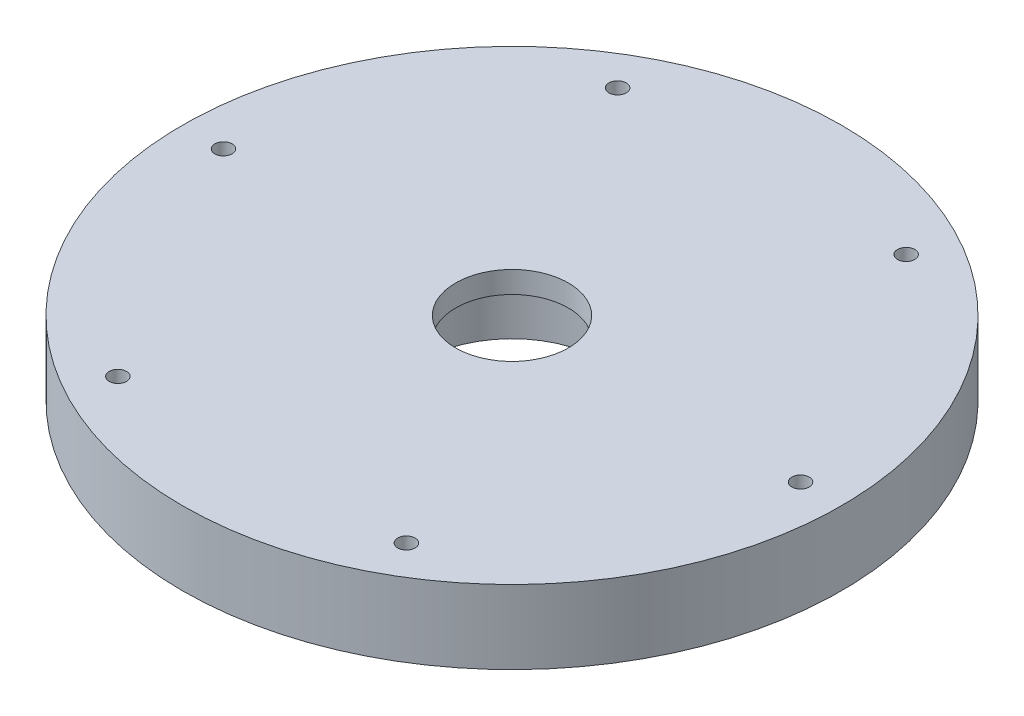
ISO-10303-21;
HEADER;
FILE_DESCRIPTION(('STEP AP214'),'2;1');
FILE_NAME('part.step','',(''),(''),'','','');
FILE_SCHEMA(('AUTOMOTIVE_DESIGN { 1 0 10303 214 1 1 1 1 }'));
ENDSEC;
DATA;
#1=APPLICATION_CONTEXT('core data for automotive mechanical design processes');
#2=APPLICATION_PROTOCOL_DEFINITION('international standard','automotive_design',2000,#1);
#3=PRODUCT_CONTEXT('',#1,'mechanical');
#4=PRODUCT('Part','Part','',(#3));
#5=PRODUCT_RELATED_PRODUCT_CATEGORY('part','',(#4));
#6=PRODUCT_DEFINITION_FORMATION('','',#4);
#7=PRODUCT_DEFINITION_CONTEXT('part definition',#1,'design');
#8=PRODUCT_DEFINITION('design','',#6,#7);
#9=PRODUCT_DEFINITION_SHAPE('','',#8);
#10=(LENGTH_UNIT() NAMED_UNIT(*) SI_UNIT(.MILLI.,.METRE.));
#11=(NAMED_UNIT(*) PLANE_ANGLE_UNIT() SI_UNIT($,.RADIAN.));
#12=(NAMED_UNIT(*) SI_UNIT($,.STERADIAN.) SOLID_ANGLE_UNIT());
#13=UNCERTAINTY_MEASURE_WITH_UNIT(LENGTH_MEASURE(1.E-05),#10,'distance_accuracy_value','');
#14=(GEOMETRIC_REPRESENTATION_CONTEXT(3) GLOBAL_UNCERTAINTY_ASSIGNED_CONTEXT((#13)) GLOBAL_UNIT_ASSIGNED_CONTEXT((#10,
#11,#12)) REPRESENTATION_CONTEXT('',''));
#15=CARTESIAN_POINT('',(0.,0.,0.));
#16=DIRECTION('',(0.,0.,1.));
#17=DIRECTION('',(1.,0.,0.));
#18=AXIS2_PLACEMENT_3D('',#15,#16,#17);
#19=CARTESIAN_POINT('',(0.,38.7086688188191,0.));
#20=DIRECTION('',(0.,1.,0.));
#21=DIRECTION('',(0.,0.,1.));
#22=AXIS2_PLACEMENT_3D('',#19,#20,#21);
#23=CYLINDRICAL_SURFACE('',#22,6.49999999999999);
#24=CARTESIAN_POINT('',(0.,0.,0.));
#25=DIRECTION('',(0.,1.,0.));
#26=DIRECTION('',(0.,0.,1.));
#27=AXIS2_PLACEMENT_3D('',#24,#25,#26);
#28=CIRCLE('',#27,6.49999999999999);
#29=CARTESIAN_POINT('',(0.,0.,6.49999999999999));
#30=VERTEX_POINT('',#29);
#31=EDGE_CURVE('E10',#30,#30,#28,.T.);
#32=ORIENTED_EDGE('',*,*,#31,.T.);
#33=EDGE_LOOP('',(#32));
#34=FACE_BOUND('',#33,.T.);
#35=CARTESIAN_POINT('',(0.,-2.5,0.));
#36=DIRECTION('',(0.,1.,0.));
#37=DIRECTION('',(0.,0.,1.));
#38=AXIS2_PLACEMENT_3D('',#35,#36,#37);
#39=CIRCLE('',#38,6.49999999999999);
#40=CARTESIAN_POINT('',(0.,-2.5,6.49999999999999));
#41=VERTEX_POINT('',#40);
#42=EDGE_CURVE('E65',#41,#41,#39,.T.);
#43=ORIENTED_EDGE('',*,*,#42,.F.);
#44=EDGE_LOOP('',(#43));
#45=FACE_BOUND('',#44,.T.);
#46=ADVANCED_FACE('F37',(#34,#45),#23,.F.);
#47=CARTESIAN_POINT('',(-6.49999999999999,0.,0.));
#48=DIRECTION('',(0.,1.,0.));
#49=DIRECTION('',(0.,0.,1.));
#50=AXIS2_PLACEMENT_3D('',#47,#48,#49);
#51=PLANE('',#50);
#52=CARTESIAN_POINT('',(-33.26875,0.,0.));
#53=DIRECTION('',(0.,-1.,0.));
#54=DIRECTION('',(0.,0.,-1.));
#55=AXIS2_PLACEMENT_3D('',#52,#53,#54);
#56=CIRCLE('',#55,0.999999999999998);
#57=CARTESIAN_POINT('',(-33.26875,0.,-0.999999999999992));
#58=VERTEX_POINT('',#57);
#59=EDGE_CURVE('E68',#58,#58,#56,.T.);
#60=ORIENTED_EDGE('',*,*,#59,.T.);
#61=EDGE_LOOP('',(#60));
#62=FACE_BOUND('',#61,.T.);
#63=CARTESIAN_POINT('',(-16.634375,0.,-28.8115826521536));
#64=DIRECTION('',(0.,-1.,0.));
#65=DIRECTION('',(0.,0.,-1.));
#66=AXIS2_PLACEMENT_3D('',#63,#64,#65);
#67=CIRCLE('',#66,0.999999999999998);
#68=CARTESIAN_POINT('',(-16.634375,0.,-29.8115826521536));
#69=VERTEX_POINT('',#68);
#70=EDGE_CURVE('E95',#69,#69,#67,.T.);
#71=ORIENTED_EDGE('',*,*,#70,.T.);
#72=EDGE_LOOP('',(#71));
#73=FACE_BOUND('',#72,.T.);
#74=CARTESIAN_POINT('',(16.634375,0.,-28.8115826521535));
#75=DIRECTION('',(0.,-1.,0.));
#76=DIRECTION('',(0.,0.,-1.));
#77=AXIS2_PLACEMENT_3D('',#74,#75,#76);
#78=CIRCLE('',#77,0.999999999999998);
#79=CARTESIAN_POINT('',(16.634375,0.,-29.8115826521535));
#80=VERTEX_POINT('',#79);
#81=EDGE_CURVE('E69',#80,#80,#78,.T.);
#82=ORIENTED_EDGE('',*,*,#81,.T.);
#83=EDGE_LOOP('',(#82));
#84=FACE_BOUND('',#83,.T.);
#85=CARTESIAN_POINT('',(33.26875,0.,0.));
#86=DIRECTION('',(0.,-1.,0.));
#87=DIRECTION('',(0.,0.,-1.));
#88=AXIS2_PLACEMENT_3D('',#85,#86,#87);
#89=CIRCLE('',#88,0.999999999999998);
#90=CARTESIAN_POINT('',(33.26875,0.,-1.));
#91=VERTEX_POINT('',#90);
#92=EDGE_CURVE('E76',#91,#91,#89,.T.);
#93=ORIENTED_EDGE('',*,*,#92,.T.);
#94=EDGE_LOOP('',(#93));
#95=FACE_BOUND('',#94,.T.);
#96=CARTESIAN_POINT('',(16.634375,0.,28.8115826521535));
#97=DIRECTION('',(0.,-1.,0.));
#98=DIRECTION('',(0.,0.,-1.));
#99=AXIS2_PLACEMENT_3D('',#96,#97,#98);
#100=CIRCLE('',#99,1.);
#101=CARTESIAN_POINT('',(16.634375,0.,27.8115826521535));
#102=VERTEX_POINT('',#101);
#103=EDGE_CURVE('E82',#102,#102,#100,.T.);
#104=ORIENTED_EDGE('',*,*,#103,.T.);
#105=EDGE_LOOP('',(#104));
#106=FACE_BOUND('',#105,.T.);
#107=CARTESIAN_POINT('',(-16.634375,0.,28.8115826521535));
#108=DIRECTION('',(0.,-1.,0.));
#109=DIRECTION('',(0.,0.,-1.));
#110=AXIS2_PLACEMENT_3D('',#107,#108,#109);
#111=CIRCLE('',#110,0.999999999999998);
#112=CARTESIAN_POINT('',(-16.634375,0.,27.8115826521535));
#113=VERTEX_POINT('',#112);
#114=EDGE_CURVE('E88',#113,#113,#111,.T.);
#115=ORIENTED_EDGE('',*,*,#114,.T.);
#116=EDGE_LOOP('',(#115));
#117=FACE_BOUND('',#116,.T.);
#118=CARTESIAN_POINT('',(0.,0.,0.));
#119=DIRECTION('',(0.,1.,0.));
#120=DIRECTION('',(0.,0.,1.));
#121=AXIS2_PLACEMENT_3D('',#118,#119,#120);
#122=CIRCLE('',#121,38.);
#123=CARTESIAN_POINT('',(0.,0.,38.));
#124=VERTEX_POINT('',#123);
#125=EDGE_CURVE('E43',#124,#124,#122,.T.);
#126=ORIENTED_EDGE('',*,*,#125,.T.);
#127=EDGE_LOOP('',(#126));
#128=FACE_BOUND('',#127,.T.);
#129=ORIENTED_EDGE('',*,*,#31,.F.);
#130=EDGE_LOOP('',(#129));
#131=FACE_BOUND('',#130,.T.);
#132=ADVANCED_FACE('F105',(#62,#73,#84,#95,#106,#117,#128,#131),#51,.T.);
#133=CARTESIAN_POINT('',(0.,38.7086688188191,0.));
#134=DIRECTION('',(0.,1.,0.));
#135=DIRECTION('',(0.,0.,1.));
#136=AXIS2_PLACEMENT_3D('',#133,#134,#135);
#137=CYLINDRICAL_SURFACE('',#136,38.);
#138=CARTESIAN_POINT('',(0.,-8.5,0.));
#139=DIRECTION('',(0.,1.,0.));
#140=DIRECTION('',(0.,0.,1.));
#141=AXIS2_PLACEMENT_3D('',#138,#139,#140);
#142=CIRCLE('',#141,38.);
#143=CARTESIAN_POINT('',(0.,-8.5,38.));
#144=VERTEX_POINT('',#143);
#145=EDGE_CURVE('E47',#144,#144,#142,.T.);
#146=ORIENTED_EDGE('',*,*,#145,.T.);
#147=EDGE_LOOP('',(#146));
#148=FACE_BOUND('',#147,.T.);
#149=ORIENTED_EDGE('',*,*,#125,.F.);
#150=EDGE_LOOP('',(#149));
#151=FACE_BOUND('',#150,.T.);
#152=ADVANCED_FACE('F143',(#148,#151),#137,.T.);
#153=CARTESIAN_POINT('',(-35.,-8.5,0.));
#154=DIRECTION('',(0.,-1.,0.));
#155=DIRECTION('',(0.,0.,-1.));
#156=AXIS2_PLACEMENT_3D('',#153,#154,#155);
#157=PLANE('',#156);
#158=CARTESIAN_POINT('',(0.,-8.5,0.));
#159=DIRECTION('',(0.,1.,0.));
#160=DIRECTION('',(0.,0.,1.));
#161=AXIS2_PLACEMENT_3D('',#158,#159,#160);
#162=CIRCLE('',#161,35.);
#163=CARTESIAN_POINT('',(0.,-8.5,35.));
#164=VERTEX_POINT('',#163);
#165=EDGE_CURVE('E51',#164,#164,#162,.T.);
#166=ORIENTED_EDGE('',*,*,#165,.T.);
#167=EDGE_LOOP('',(#166));
#168=FACE_BOUND('',#167,.T.);
#169=ORIENTED_EDGE('',*,*,#145,.F.);
#170=EDGE_LOOP('',(#169));
#171=FACE_BOUND('',#170,.T.);
#172=ADVANCED_FACE('F137',(#168,#171),#157,.T.);
#173=CARTESIAN_POINT('',(0.,38.7086688188191,0.));
#174=DIRECTION('',(0.,1.,0.));
#175=DIRECTION('',(0.,0.,1.));
#176=AXIS2_PLACEMENT_3D('',#173,#174,#175);
#177=CYLINDRICAL_SURFACE('',#176,35.);
#178=CARTESIAN_POINT('',(0.,-9.75,0.));
#179=DIRECTION('',(0.,1.,0.));
#180=DIRECTION('',(0.,0.,1.));
#181=AXIS2_PLACEMENT_3D('',#178,#179,#180);
#182=CIRCLE('',#181,35.);
#183=CARTESIAN_POINT('',(0.,-9.75,35.));
#184=VERTEX_POINT('',#183);
#185=EDGE_CURVE('E56',#184,#184,#182,.T.);
#186=ORIENTED_EDGE('',*,*,#185,.T.);
#187=EDGE_LOOP('',(#186));
#188=FACE_BOUND('',#187,.T.);
#189=ORIENTED_EDGE('',*,*,#165,.F.);
#190=EDGE_LOOP('',(#189));
#191=FACE_BOUND('',#190,.T.);
#192=ADVANCED_FACE('F119',(#188,#191),#177,.T.);
#193=CARTESIAN_POINT('',(-10.5,-9.75,0.));
#194=DIRECTION('',(0.,-1.,0.));
#195=DIRECTION('',(0.,0.,-1.));
#196=AXIS2_PLACEMENT_3D('',#193,#194,#195);
#197=PLANE('',#196);
#198=CARTESIAN_POINT('',(-33.26875,-9.75,0.));
#199=DIRECTION('',(0.,-1.,0.));
#200=DIRECTION('',(0.,0.,-1.));
#201=AXIS2_PLACEMENT_3D('',#198,#199,#200);
#202=CIRCLE('',#201,0.999999999999998);
#203=CARTESIAN_POINT('',(-33.26875,-9.75,-0.999999999999992));
#204=VERTEX_POINT('',#203);
#205=EDGE_CURVE('E94',#204,#204,#202,.T.);
#206=ORIENTED_EDGE('',*,*,#205,.F.);
#207=EDGE_LOOP('',(#206));
#208=FACE_BOUND('',#207,.T.);
#209=CARTESIAN_POINT('',(-16.634375,-9.75,-28.8115826521536));
#210=DIRECTION('',(0.,-1.,0.));
#211=DIRECTION('',(0.,0.,-1.));
#212=AXIS2_PLACEMENT_3D('',#209,#210,#211);
#213=CIRCLE('',#212,0.999999999999998);
#214=CARTESIAN_POINT('',(-16.634375,-9.75,-29.8115826521536));
#215=VERTEX_POINT('',#214);
#216=EDGE_CURVE('E73',#215,#215,#213,.T.);
#217=ORIENTED_EDGE('',*,*,#216,.F.);
#218=EDGE_LOOP('',(#217));
#219=FACE_BOUND('',#218,.T.);
#220=CARTESIAN_POINT('',(16.634375,-9.75,-28.8115826521535));
#221=DIRECTION('',(0.,-1.,0.));
#222=DIRECTION('',(0.,0.,-1.));
#223=AXIS2_PLACEMENT_3D('',#220,#221,#222);
#224=CIRCLE('',#223,0.999999999999998);
#225=CARTESIAN_POINT('',(16.634375,-9.75,-29.8115826521535));
#226=VERTEX_POINT('',#225);
#227=EDGE_CURVE('E72',#226,#226,#224,.T.);
#228=ORIENTED_EDGE('',*,*,#227,.F.);
#229=EDGE_LOOP('',(#228));
#230=FACE_BOUND('',#229,.T.);
#231=CARTESIAN_POINT('',(33.26875,-9.75,0.));
#232=DIRECTION('',(0.,-1.,0.));
#233=DIRECTION('',(0.,0.,-1.));
#234=AXIS2_PLACEMENT_3D('',#231,#232,#233);
#235=CIRCLE('',#234,0.999999999999998);
#236=CARTESIAN_POINT('',(33.26875,-9.75,-1.));
#237=VERTEX_POINT('',#236);
#238=EDGE_CURVE('E79',#237,#237,#235,.T.);
#239=ORIENTED_EDGE('',*,*,#238,.F.);
#240=EDGE_LOOP('',(#239));
#241=FACE_BOUND('',#240,.T.);
#242=CARTESIAN_POINT('',(16.634375,-9.75,28.8115826521535));
#243=DIRECTION('',(0.,-1.,0.));
#244=DIRECTION('',(0.,0.,-1.));
#245=AXIS2_PLACEMENT_3D('',#242,#243,#244);
#246=CIRCLE('',#245,1.);
#247=CARTESIAN_POINT('',(16.634375,-9.75,27.8115826521535));
#248=VERTEX_POINT('',#247);
#249=EDGE_CURVE('E85',#248,#248,#246,.T.);
#250=ORIENTED_EDGE('',*,*,#249,.F.);
#251=EDGE_LOOP('',(#250));
#252=FACE_BOUND('',#251,.T.);
#253=CARTESIAN_POINT('',(-16.634375,-9.75,28.8115826521535));
#254=DIRECTION('',(0.,-1.,0.));
#255=DIRECTION('',(0.,0.,-1.));
#256=AXIS2_PLACEMENT_3D('',#253,#254,#255);
#257=CIRCLE('',#256,0.999999999999998);
#258=CARTESIAN_POINT('',(-16.634375,-9.75,27.8115826521535));
#259=VERTEX_POINT('',#258);
#260=EDGE_CURVE('E91',#259,#259,#257,.T.);
#261=ORIENTED_EDGE('',*,*,#260,.F.);
#262=EDGE_LOOP('',(#261));
#263=FACE_BOUND('',#262,.T.);
#264=CARTESIAN_POINT('',(0.,-9.74999999999999,0.));
#265=DIRECTION('',(0.,1.,0.));
#266=DIRECTION('',(0.,0.,1.));
#267=AXIS2_PLACEMENT_3D('',#264,#265,#266);
#268=CIRCLE('',#267,10.5);
#269=CARTESIAN_POINT('',(0.,-9.74999999999999,10.5));
#270=VERTEX_POINT('',#269);
#271=EDGE_CURVE('E59',#270,#270,#268,.T.);
#272=ORIENTED_EDGE('',*,*,#271,.T.);
#273=EDGE_LOOP('',(#272));
#274=FACE_BOUND('',#273,.T.);
#275=ORIENTED_EDGE('',*,*,#185,.F.);
#276=EDGE_LOOP('',(#275));
#277=FACE_BOUND('',#276,.T.);
#278=ADVANCED_FACE('F115',(#208,#219,#230,#241,#252,#263,#274,#277),#197,.T.);
#279=CARTESIAN_POINT('',(0.,38.7086688188191,0.));
#280=DIRECTION('',(0.,1.,0.));
#281=DIRECTION('',(0.,0.,1.));
#282=AXIS2_PLACEMENT_3D('',#279,#280,#281);
#283=CYLINDRICAL_SURFACE('',#282,10.5);
#284=CARTESIAN_POINT('',(0.,-2.5,0.));
#285=DIRECTION('',(0.,1.,0.));
#286=DIRECTION('',(0.,0.,1.));
#287=AXIS2_PLACEMENT_3D('',#284,#285,#286);
#288=CIRCLE('',#287,10.5);
#289=CARTESIAN_POINT('',(0.,-2.5,10.5));
#290=VERTEX_POINT('',#289);
#291=EDGE_CURVE('E62',#290,#290,#288,.T.);
#292=ORIENTED_EDGE('',*,*,#291,.T.);
#293=EDGE_LOOP('',(#292));
#294=FACE_BOUND('',#293,.T.);
#295=ORIENTED_EDGE('',*,*,#271,.F.);
#296=EDGE_LOOP('',(#295));
#297=FACE_BOUND('',#296,.T.);
#298=ADVANCED_FACE('F118',(#294,#297),#283,.F.);
#299=CARTESIAN_POINT('',(-10.5,-2.5,0.));
#300=DIRECTION('',(0.,-1.,0.));
#301=DIRECTION('',(0.,0.,-1.));
#302=AXIS2_PLACEMENT_3D('',#299,#300,#301);
#303=PLANE('',#302);
#304=ORIENTED_EDGE('',*,*,#42,.T.);
#305=EDGE_LOOP('',(#304));
#306=FACE_BOUND('',#305,.T.);
#307=ORIENTED_EDGE('',*,*,#291,.F.);
#308=EDGE_LOOP('',(#307));
#309=FACE_BOUND('',#308,.T.);
#310=ADVANCED_FACE('F159',(#306,#309),#303,.T.);
#311=CARTESIAN_POINT('',(-16.634375,0.,28.8115826521535));
#312=DIRECTION('',(0.,-1.,0.));
#313=DIRECTION('',(0.,0.,-1.));
#314=AXIS2_PLACEMENT_3D('',#311,#312,#313);
#315=CYLINDRICAL_SURFACE('',#314,0.999999999999998);
#316=ORIENTED_EDGE('',*,*,#114,.F.);
#317=EDGE_LOOP('',(#316));
#318=FACE_BOUND('',#317,.T.);
#319=ORIENTED_EDGE('',*,*,#260,.T.);
#320=EDGE_LOOP('',(#319));
#321=FACE_BOUND('',#320,.T.);
#322=ADVANCED_FACE('F162',(#318,#321),#315,.F.);
#323=CARTESIAN_POINT('',(16.634375,0.,28.8115826521535));
#324=DIRECTION('',(0.,-1.,0.));
#325=DIRECTION('',(0.,0.,-1.));
#326=AXIS2_PLACEMENT_3D('',#323,#324,#325);
#327=CYLINDRICAL_SURFACE('',#326,1.);
#328=ORIENTED_EDGE('',*,*,#103,.F.);
#329=EDGE_LOOP('',(#328));
#330=FACE_BOUND('',#329,.T.);
#331=ORIENTED_EDGE('',*,*,#249,.T.);
#332=EDGE_LOOP('',(#331));
#333=FACE_BOUND('',#332,.T.);
#334=ADVANCED_FACE('F179',(#330,#333),#327,.F.);
#335=CARTESIAN_POINT('',(33.26875,0.,0.));
#336=DIRECTION('',(0.,-1.,0.));
#337=DIRECTION('',(0.,0.,-1.));
#338=AXIS2_PLACEMENT_3D('',#335,#336,#337);
#339=CYLINDRICAL_SURFACE('',#338,0.999999999999998);
#340=ORIENTED_EDGE('',*,*,#92,.F.);
#341=EDGE_LOOP('',(#340));
#342=FACE_BOUND('',#341,.T.);
#343=ORIENTED_EDGE('',*,*,#238,.T.);
#344=EDGE_LOOP('',(#343));
#345=FACE_BOUND('',#344,.T.);
#346=ADVANCED_FACE('F175',(#342,#345),#339,.F.);
#347=CARTESIAN_POINT('',(16.634375,0.,-28.8115826521535));
#348=DIRECTION('',(0.,-1.,0.));
#349=DIRECTION('',(0.,0.,-1.));
#350=AXIS2_PLACEMENT_3D('',#347,#348,#349);
#351=CYLINDRICAL_SURFACE('',#350,0.999999999999998);
#352=ORIENTED_EDGE('',*,*,#81,.F.);
#353=EDGE_LOOP('',(#352));
#354=FACE_BOUND('',#353,.T.);
#355=ORIENTED_EDGE('',*,*,#227,.T.);
#356=EDGE_LOOP('',(#355));
#357=FACE_BOUND('',#356,.T.);
#358=ADVANCED_FACE('F172',(#354,#357),#351,.F.);
#359=CARTESIAN_POINT('',(-16.634375,0.,-28.8115826521536));
#360=DIRECTION('',(0.,-1.,0.));
#361=DIRECTION('',(0.,0.,-1.));
#362=AXIS2_PLACEMENT_3D('',#359,#360,#361);
#363=CYLINDRICAL_SURFACE('',#362,0.999999999999998);
#364=ORIENTED_EDGE('',*,*,#70,.F.);
#365=EDGE_LOOP('',(#364));
#366=FACE_BOUND('',#365,.T.);
#367=ORIENTED_EDGE('',*,*,#216,.T.);
#368=EDGE_LOOP('',(#367));
#369=FACE_BOUND('',#368,.T.);
#370=ADVANCED_FACE('F111',(#366,#369),#363,.F.);
#371=CARTESIAN_POINT('',(-33.26875,0.,0.));
#372=DIRECTION('',(0.,-1.,0.));
#373=DIRECTION('',(0.,0.,-1.));
#374=AXIS2_PLACEMENT_3D('',#371,#372,#373);
#375=CYLINDRICAL_SURFACE('',#374,0.999999999999998);
#376=ORIENTED_EDGE('',*,*,#59,.F.);
#377=EDGE_LOOP('',(#376));
#378=FACE_BOUND('',#377,.T.);
#379=ORIENTED_EDGE('',*,*,#205,.T.);
#380=EDGE_LOOP('',(#379));
#381=FACE_BOUND('',#380,.T.);
#382=ADVANCED_FACE('F108',(#378,#381),#375,.F.);
#383=CLOSED_SHELL('',(#46,#132,#152,#172,#192,#278,#298,#310,#322,#334,#346,#358,#370,#382));
#384=MANIFOLD_SOLID_BREP('B2',#383);
#385=ADVANCED_BREP_SHAPE_REPRESENTATION('',(#18,#384),#14);
#386=SHAPE_DEFINITION_REPRESENTATION(#9,#385);
ENDSEC;
END-ISO-10303-21;
